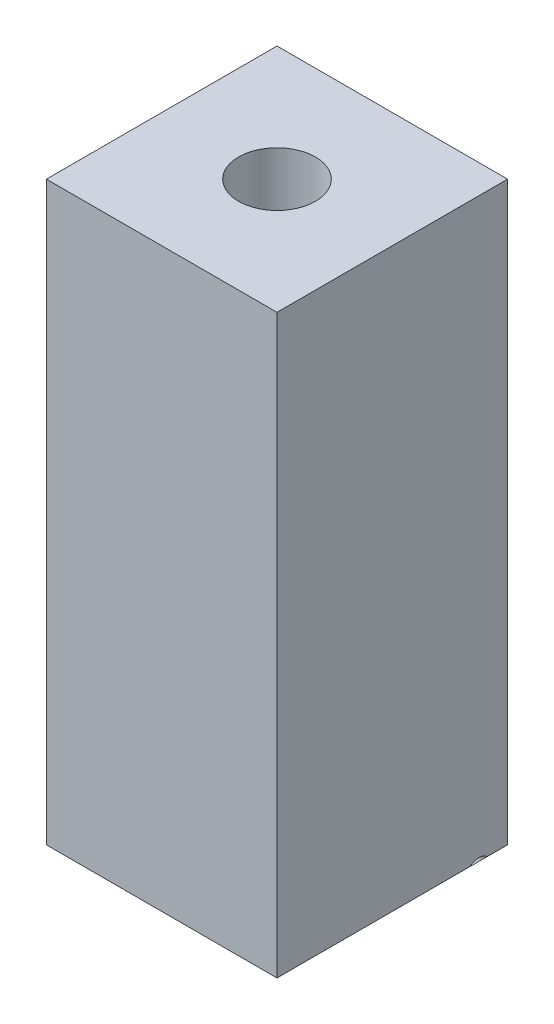
ISO-10303-21;
HEADER;
FILE_DESCRIPTION(('STEP AP214'),'2;1');
FILE_NAME('part.step','',(''),(''),'','','');
FILE_SCHEMA(('AUTOMOTIVE_DESIGN { 1 0 10303 214 1 1 1 1 }'));
ENDSEC;
DATA;
#1=APPLICATION_CONTEXT('core data for automotive mechanical design processes');
#2=APPLICATION_PROTOCOL_DEFINITION('international standard','automotive_design',2000,#1);
#3=PRODUCT_CONTEXT('',#1,'mechanical');
#4=PRODUCT('Part','Part','',(#3));
#5=PRODUCT_RELATED_PRODUCT_CATEGORY('part','',(#4));
#6=PRODUCT_DEFINITION_FORMATION('','',#4);
#7=PRODUCT_DEFINITION_CONTEXT('part definition',#1,'design');
#8=PRODUCT_DEFINITION('design','',#6,#7);
#9=PRODUCT_DEFINITION_SHAPE('','',#8);
#10=(LENGTH_UNIT() NAMED_UNIT(*) SI_UNIT(.MILLI.,.METRE.));
#11=(NAMED_UNIT(*) PLANE_ANGLE_UNIT() SI_UNIT($,.RADIAN.));
#12=(NAMED_UNIT(*) SI_UNIT($,.STERADIAN.) SOLID_ANGLE_UNIT());
#13=UNCERTAINTY_MEASURE_WITH_UNIT(LENGTH_MEASURE(1.E-05),#10,'distance_accuracy_value','');
#14=(GEOMETRIC_REPRESENTATION_CONTEXT(3) GLOBAL_UNCERTAINTY_ASSIGNED_CONTEXT((#13)) GLOBAL_UNIT_ASSIGNED_CONTEXT((#10,
#11,#12)) REPRESENTATION_CONTEXT('',''));
#15=CARTESIAN_POINT('',(0.,0.,0.));
#16=DIRECTION('',(0.,0.,1.));
#17=DIRECTION('',(1.,0.,0.));
#18=AXIS2_PLACEMENT_3D('',#15,#16,#17);
#19=CARTESIAN_POINT('',(30.,0.,66.4536174180387));
#20=DIRECTION('',(0.,-1.,0.));
#21=DIRECTION('',(0.,0.,-1.));
#22=AXIS2_PLACEMENT_3D('',#19,#20,#21);
#23=PLANE('',#22);
#24=CARTESIAN_POINT('',(0.,0.,96.4536174180387));
#25=DIRECTION('',(0.,-1.,0.));
#26=DIRECTION('',(0.,0.,-1.));
#27=AXIS2_PLACEMENT_3D('',#24,#25,#26);
#28=CIRCLE('',#27,23.5);
#29=CARTESIAN_POINT('',(19.9999999999999,0.,108.792580097292));
#30=VERTEX_POINT('',#29);
#31=CARTESIAN_POINT('',(12.3389626792527,0.,116.453617418039));
#32=VERTEX_POINT('',#31);
#33=EDGE_CURVE('E298',#30,#32,#28,.T.);
#34=ORIENTED_EDGE('',*,*,#33,.F.);
#35=DIRECTION('',(0.,0.,1.));
#36=VECTOR('',#35,1.);
#37=CARTESIAN_POINT('',(19.9999999999999,0.,126.453617418039));
#38=LINE('',#37,#36);
#39=CARTESIAN_POINT('',(19.9999999999999,0.,116.453617418039));
#40=VERTEX_POINT('',#39);
#41=EDGE_CURVE('E258',#30,#40,#38,.T.);
#42=ORIENTED_EDGE('',*,*,#41,.T.);
#43=DIRECTION('',(-1.,0.,0.));
#44=VECTOR('',#43,1.);
#45=CARTESIAN_POINT('',(30.,0.,116.453617418039));
#46=LINE('',#45,#44);
#47=EDGE_CURVE('E256',#40,#32,#46,.T.);
#48=ORIENTED_EDGE('',*,*,#47,.T.);
#49=EDGE_LOOP('',(#34,#42,#48));
#50=FACE_BOUND('',#49,.T.);
#51=ADVANCED_FACE('F45',(#50),#23,.T.);
#52=CARTESIAN_POINT('',(-12.3389626792527,0.,116.453617418039));
#53=VERTEX_POINT('',#52);
#54=CARTESIAN_POINT('',(-19.9999999999999,0.,108.792580097292));
#55=VERTEX_POINT('',#54);
#56=EDGE_CURVE('E238',#53,#55,#28,.T.);
#57=ORIENTED_EDGE('',*,*,#56,.F.);
#58=DIRECTION('',(-1.,0.,0.));
#59=VECTOR('',#58,1.);
#60=CARTESIAN_POINT('',(30.,0.,116.453617418039));
#61=LINE('',#60,#59);
#62=CARTESIAN_POINT('',(-19.9999999999999,0.,116.453617418039));
#63=VERTEX_POINT('',#62);
#64=EDGE_CURVE('E250',#53,#63,#61,.T.);
#65=ORIENTED_EDGE('',*,*,#64,.T.);
#66=DIRECTION('',(0.,0.,-1.));
#67=VECTOR('',#66,1.);
#68=CARTESIAN_POINT('',(-19.9999999999999,0.,66.4536174180387));
#69=LINE('',#68,#67);
#70=EDGE_CURVE('E248',#63,#55,#69,.T.);
#71=ORIENTED_EDGE('',*,*,#70,.T.);
#72=EDGE_LOOP('',(#57,#65,#71));
#73=FACE_BOUND('',#72,.T.);
#74=ADVANCED_FACE('F204',(#73),#23,.T.);
#75=CARTESIAN_POINT('',(-19.9999999999999,0.,84.1146547387855));
#76=VERTEX_POINT('',#75);
#77=CARTESIAN_POINT('',(-12.3389626792532,0.,76.4536174180388));
#78=VERTEX_POINT('',#77);
#79=EDGE_CURVE('E231',#76,#78,#28,.T.);
#80=ORIENTED_EDGE('',*,*,#79,.F.);
#81=DIRECTION('',(0.,0.,-1.));
#82=VECTOR('',#81,1.);
#83=CARTESIAN_POINT('',(-19.9999999999999,0.,66.4536174180387));
#84=LINE('',#83,#82);
#85=CARTESIAN_POINT('',(-19.9999999999999,0.,76.4536174180388));
#86=VERTEX_POINT('',#85);
#87=EDGE_CURVE('E233',#76,#86,#84,.T.);
#88=ORIENTED_EDGE('',*,*,#87,.T.);
#89=DIRECTION('',(1.,0.,0.));
#90=VECTOR('',#89,1.);
#91=CARTESIAN_POINT('',(30.,0.,76.4536174180388));
#92=LINE('',#91,#90);
#93=EDGE_CURVE('E236',#86,#78,#92,.T.);
#94=ORIENTED_EDGE('',*,*,#93,.T.);
#95=EDGE_LOOP('',(#80,#88,#94));
#96=FACE_BOUND('',#95,.T.);
#97=ADVANCED_FACE('F211',(#96),#23,.T.);
#98=CARTESIAN_POINT('',(30.,160.,66.4536174180387));
#99=DIRECTION('',(0.,0.,-1.));
#100=DIRECTION('',(-1.,0.,0.));
#101=AXIS2_PLACEMENT_3D('',#98,#99,#100);
#102=PLANE('',#101);
#103=DIRECTION('',(0.,-1.,0.));
#104=VECTOR('',#103,1.);
#105=CARTESIAN_POINT('',(30.,160.,66.4536174180387));
#106=LINE('',#105,#104);
#107=CARTESIAN_POINT('',(30.,160.,66.4536174180387));
#108=VERTEX_POINT('',#107);
#109=CARTESIAN_POINT('',(30.,10.0000000000002,66.4536174180387));
#110=VERTEX_POINT('',#109);
#111=EDGE_CURVE('E150',#108,#110,#106,.T.);
#112=ORIENTED_EDGE('',*,*,#111,.T.);
#113=DIRECTION('',(-1.,0.,0.));
#114=VECTOR('',#113,1.);
#115=CARTESIAN_POINT('',(30.,10.0000000000002,66.4536174180387));
#116=LINE('',#115,#114);
#117=CARTESIAN_POINT('',(-30.,10.0000000000002,66.4536174180387));
#118=VERTEX_POINT('',#117);
#119=EDGE_CURVE('E11',#110,#118,#116,.T.);
#120=ORIENTED_EDGE('',*,*,#119,.T.);
#121=DIRECTION('',(0.,-1.,0.));
#122=VECTOR('',#121,1.);
#123=CARTESIAN_POINT('',(-30.,160.,66.4536174180387));
#124=LINE('',#123,#122);
#125=CARTESIAN_POINT('',(-30.,160.,66.4536174180387));
#126=VERTEX_POINT('',#125);
#127=EDGE_CURVE('E164',#126,#118,#124,.T.);
#128=ORIENTED_EDGE('',*,*,#127,.F.);
#129=DIRECTION('',(-1.,0.,0.));
#130=VECTOR('',#129,1.);
#131=CARTESIAN_POINT('',(30.,160.,66.4536174180387));
#132=LINE('',#131,#130);
#133=EDGE_CURVE('E157',#108,#126,#132,.T.);
#134=ORIENTED_EDGE('',*,*,#133,.F.);
#135=EDGE_LOOP('',(#112,#120,#128,#134));
#136=FACE_BOUND('',#135,.T.);
#137=ADVANCED_FACE('F224',(#136),#102,.T.);
#138=CARTESIAN_POINT('',(30.,160.,126.453617418039));
#139=DIRECTION('',(0.,1.,0.));
#140=DIRECTION('',(0.,0.,1.));
#141=AXIS2_PLACEMENT_3D('',#138,#139,#140);
#142=PLANE('',#141);
#143=CARTESIAN_POINT('',(0.,160.,96.4536174180387));
#144=DIRECTION('',(0.,-1.,0.));
#145=DIRECTION('',(0.,0.,-1.));
#146=AXIS2_PLACEMENT_3D('',#143,#144,#145);
#147=CIRCLE('',#146,9.99999999999999);
#148=CARTESIAN_POINT('',(0.,160.,86.4536174180387));
#149=VERTEX_POINT('',#148);
#150=EDGE_CURVE('E181',#149,#149,#147,.T.);
#151=ORIENTED_EDGE('',*,*,#150,.T.);
#152=EDGE_LOOP('',(#151));
#153=FACE_BOUND('',#152,.T.);
#154=DIRECTION('',(0.,0.,-1.));
#155=VECTOR('',#154,1.);
#156=CARTESIAN_POINT('',(-30.,160.,126.453617418039));
#157=LINE('',#156,#155);
#158=CARTESIAN_POINT('',(-30.,160.,126.453617418039));
#159=VERTEX_POINT('',#158);
#160=EDGE_CURVE('E156',#159,#126,#157,.T.);
#161=ORIENTED_EDGE('',*,*,#160,.F.);
#162=DIRECTION('',(-1.,0.,0.));
#163=VECTOR('',#162,1.);
#164=CARTESIAN_POINT('',(30.,160.,126.453617418039));
#165=LINE('',#164,#163);
#166=CARTESIAN_POINT('',(30.,160.,126.453617418039));
#167=VERTEX_POINT('',#166);
#168=EDGE_CURVE('E141',#167,#159,#165,.T.);
#169=ORIENTED_EDGE('',*,*,#168,.F.);
#170=DIRECTION('',(0.,0.,-1.));
#171=VECTOR('',#170,1.);
#172=CARTESIAN_POINT('',(30.,160.,126.453617418039));
#173=LINE('',#172,#171);
#174=EDGE_CURVE('E149',#167,#108,#173,.T.);
#175=ORIENTED_EDGE('',*,*,#174,.T.);
#176=ORIENTED_EDGE('',*,*,#133,.T.);
#177=EDGE_LOOP('',(#161,#169,#175,#176));
#178=FACE_BOUND('',#177,.T.);
#179=ADVANCED_FACE('F154',(#153,#178),#142,.T.);
#180=CARTESIAN_POINT('',(30.,0.,126.453617418039));
#181=DIRECTION('',(0.,0.,1.));
#182=DIRECTION('',(1.,0.,0.));
#183=AXIS2_PLACEMENT_3D('',#180,#181,#182);
#184=PLANE('',#183);
#185=DIRECTION('',(0.,1.,0.));
#186=VECTOR('',#185,1.);
#187=CARTESIAN_POINT('',(-30.,0.,126.453617418039));
#188=LINE('',#187,#186);
#189=CARTESIAN_POINT('',(-30.,10.0000000000002,126.453617418039));
#190=VERTEX_POINT('',#189);
#191=EDGE_CURVE('E166',#190,#159,#188,.T.);
#192=ORIENTED_EDGE('',*,*,#191,.F.);
#193=DIRECTION('',(1.,0.,0.));
#194=VECTOR('',#193,1.);
#195=CARTESIAN_POINT('',(30.,10.0000000000002,126.453617418039));
#196=LINE('',#195,#194);
#197=CARTESIAN_POINT('',(30.,10.0000000000002,126.453617418039));
#198=VERTEX_POINT('',#197);
#199=EDGE_CURVE('E144',#190,#198,#196,.T.);
#200=ORIENTED_EDGE('',*,*,#199,.T.);
#201=DIRECTION('',(0.,1.,0.));
#202=VECTOR('',#201,1.);
#203=CARTESIAN_POINT('',(30.,0.,126.453617418039));
#204=LINE('',#203,#202);
#205=EDGE_CURVE('E138',#198,#167,#204,.T.);
#206=ORIENTED_EDGE('',*,*,#205,.T.);
#207=ORIENTED_EDGE('',*,*,#168,.T.);
#208=EDGE_LOOP('',(#192,#200,#206,#207));
#209=FACE_BOUND('',#208,.T.);
#210=ADVANCED_FACE('F140',(#209),#184,.T.);
#211=DIRECTION('',(1.,0.,0.));
#212=VECTOR('',#211,1.);
#213=CARTESIAN_POINT('',(30.,0.,76.4536174180388));
#214=LINE('',#213,#212);
#215=CARTESIAN_POINT('',(12.3389626792532,0.,76.4536174180388));
#216=VERTEX_POINT('',#215);
#217=CARTESIAN_POINT('',(19.9999999999999,0.,76.4536174180388));
#218=VERTEX_POINT('',#217);
#219=EDGE_CURVE('E170',#216,#218,#214,.T.);
#220=ORIENTED_EDGE('',*,*,#219,.T.);
#221=DIRECTION('',(0.,0.,1.));
#222=VECTOR('',#221,1.);
#223=CARTESIAN_POINT('',(19.9999999999999,0.,126.453617418039));
#224=LINE('',#223,#222);
#225=CARTESIAN_POINT('',(19.9999999999999,0.,84.1146547387855));
#226=VERTEX_POINT('',#225);
#227=EDGE_CURVE('E252',#218,#226,#224,.T.);
#228=ORIENTED_EDGE('',*,*,#227,.T.);
#229=EDGE_CURVE('E240',#216,#226,#28,.T.);
#230=ORIENTED_EDGE('',*,*,#229,.F.);
#231=EDGE_LOOP('',(#220,#228,#230));
#232=FACE_BOUND('',#231,.T.);
#233=ADVANCED_FACE('F207',(#232),#23,.T.);
#234=CARTESIAN_POINT('',(30.,0.,0.));
#235=DIRECTION('',(-1.,0.,0.));
#236=DIRECTION('',(0.,0.,1.));
#237=AXIS2_PLACEMENT_3D('',#234,#235,#236);
#238=PLANE('',#237);
#239=ORIENTED_EDGE('',*,*,#205,.F.);
#240=DIRECTION('',(0.,0.,-1.));
#241=VECTOR('',#240,1.);
#242=CARTESIAN_POINT('',(30.,10.0000000000002,66.4536174180387));
#243=LINE('',#242,#241);
#244=CARTESIAN_POINT('',(30.,10.0000000000002,76.1835277301363));
#245=VERTEX_POINT('',#244);
#246=EDGE_CURVE('E269',#198,#245,#243,.T.);
#247=ORIENTED_EDGE('',*,*,#246,.T.);
#248=CARTESIAN_POINT('',(30.,7.5,73.9536174180387));
#249=DIRECTION('',(-1.,0.,0.));
#250=DIRECTION('',(0.,0.,1.));
#251=AXIS2_PLACEMENT_3D('',#248,#249,#250);
#252=CIRCLE('',#251,3.34999999999999);
#253=CARTESIAN_POINT('',(30.,10.0000000000002,71.7237071059411));
#254=VERTEX_POINT('',#253);
#255=EDGE_CURVE('E167',#245,#254,#252,.T.);
#256=ORIENTED_EDGE('',*,*,#255,.T.);
#257=DIRECTION('',(0.,0.,-1.));
#258=VECTOR('',#257,1.);
#259=CARTESIAN_POINT('',(30.,10.0000000000002,66.4536174180387));
#260=LINE('',#259,#258);
#261=EDGE_CURVE('E267',#254,#110,#260,.T.);
#262=ORIENTED_EDGE('',*,*,#261,.T.);
#263=ORIENTED_EDGE('',*,*,#111,.F.);
#264=ORIENTED_EDGE('',*,*,#174,.F.);
#265=EDGE_LOOP('',(#239,#247,#256,#262,#263,#264));
#266=FACE_BOUND('',#265,.T.);
#267=ADVANCED_FACE('F160',(#266),#238,.F.);
#268=CARTESIAN_POINT('',(-30.,0.,0.));
#269=DIRECTION('',(-1.,0.,0.));
#270=DIRECTION('',(0.,0.,1.));
#271=AXIS2_PLACEMENT_3D('',#268,#269,#270);
#272=PLANE('',#271);
#273=ORIENTED_EDGE('',*,*,#127,.T.);
#274=DIRECTION('',(0.,0.,1.));
#275=VECTOR('',#274,1.);
#276=CARTESIAN_POINT('',(-30.,10.0000000000002,0.));
#277=LINE('',#276,#275);
#278=CARTESIAN_POINT('',(-30.,10.0000000000002,71.7237071059411));
#279=VERTEX_POINT('',#278);
#280=EDGE_CURVE('E55',#118,#279,#277,.T.);
#281=ORIENTED_EDGE('',*,*,#280,.T.);
#282=CARTESIAN_POINT('',(-30.,7.5,73.9536174180387));
#283=DIRECTION('',(-1.,0.,0.));
#284=DIRECTION('',(0.,0.,1.));
#285=AXIS2_PLACEMENT_3D('',#282,#283,#284);
#286=CIRCLE('',#285,3.34999999999999);
#287=CARTESIAN_POINT('',(-30.,10.0000000000002,76.1835277301363));
#288=VERTEX_POINT('',#287);
#289=EDGE_CURVE('E180',#288,#279,#286,.T.);
#290=ORIENTED_EDGE('',*,*,#289,.F.);
#291=DIRECTION('',(0.,0.,1.));
#292=VECTOR('',#291,1.);
#293=CARTESIAN_POINT('',(-30.,10.0000000000002,0.));
#294=LINE('',#293,#292);
#295=EDGE_CURVE('E69',#288,#190,#294,.T.);
#296=ORIENTED_EDGE('',*,*,#295,.T.);
#297=ORIENTED_EDGE('',*,*,#191,.T.);
#298=ORIENTED_EDGE('',*,*,#160,.T.);
#299=EDGE_LOOP('',(#273,#281,#290,#296,#297,#298));
#300=FACE_BOUND('',#299,.T.);
#301=ADVANCED_FACE('F222',(#300),#272,.T.);
#302=CARTESIAN_POINT('',(-30.,7.5,73.9536174180387));
#303=DIRECTION('',(-1.,0.,0.));
#304=DIRECTION('',(0.,0.,1.));
#305=AXIS2_PLACEMENT_3D('',#302,#303,#304);
#306=CYLINDRICAL_SURFACE('',#305,3.34999999999999);
#307=CARTESIAN_POINT('',(13.6208479912229,7.5,77.3036174180387));
#308=CARTESIAN_POINT('',(13.6208466619542,7.6311400342407,77.3036163206529));
#309=CARTESIAN_POINT('',(13.6099252487751,7.76228647985704,77.2958343639586));
#310=CARTESIAN_POINT('',(13.5673236686955,8.01941730547468,77.2656426726311));
#311=CARTESIAN_POINT('',(13.5356257146644,8.14539716399272,77.2432204042549));
#312=CARTESIAN_POINT('',(13.4545806660588,8.38718801192244,77.1863746845912));
#313=CARTESIAN_POINT('',(13.4053920316084,8.503079033955,77.152059051906));
#314=CARTESIAN_POINT('',(13.2925504315977,8.72408430713149,77.0741743978733));
#315=CARTESIAN_POINT('',(13.2288904079872,8.82919326317427,77.0306008619002));
#316=CARTESIAN_POINT('',(13.0564704708785,9.07635564573666,76.9140704555163));
#317=CARTESIAN_POINT('',(12.9407965778896,9.21166142181079,76.8371006716536));
#318=CARTESIAN_POINT('',(12.6917538316594,9.45915276178947,76.6750537610005));
#319=CARTESIAN_POINT('',(12.5583411355996,9.57127922285575,76.589956698768));
#320=CARTESIAN_POINT('',(12.3030731437344,9.75767369357391,76.4310544039084));
#321=CARTESIAN_POINT('',(12.1831508574361,9.83513668448344,76.3578108816436));
#322=CARTESIAN_POINT('',(11.9366888516174,9.97785567557276,76.210443644832));
#323=CARTESIAN_POINT('',(11.8101446468933,10.043103261335,76.1363193606902));
#324=CARTESIAN_POINT('',(11.5518047928005,10.1629911391905,75.9883295047865));
#325=CARTESIAN_POINT('',(11.4200029515304,10.217618451013,75.9144643566249));
#326=CARTESIAN_POINT('',(11.1522743482304,10.3175972118923,75.7678714800301));
#327=CARTESIAN_POINT('',(11.0163460156705,10.3629450770784,75.6951442010375));
#328=CARTESIAN_POINT('',(10.7449327231521,10.4444362373895,75.5533968790422));
#329=CARTESIAN_POINT('',(10.6095369160104,10.4807969725784,75.4843298295574));
#330=CARTESIAN_POINT('',(10.3361171064447,10.5468529932768,75.3482145432371));
#331=CARTESIAN_POINT('',(10.1980925903566,10.576546961261,75.2811667077133));
#332=CARTESIAN_POINT('',(9.78052834004733,10.6569624948289,75.0834031992393));
#333=CARTESIAN_POINT('',(9.49765148805558,10.6989739102928,74.9561479182778));
#334=CARTESIAN_POINT('',(8.92462141111508,10.7654854585037,74.7119858305651));
#335=CARTESIAN_POINT('',(8.63444934773781,10.7899340895518,74.5951103329764));
#336=CARTESIAN_POINT('',(8.04906953906571,10.8255681565136,74.3728459750843));
#337=CARTESIAN_POINT('',(7.75386315757159,10.8367571283518,74.2674540592895));
#338=CARTESIAN_POINT('',(7.15845739235453,10.8495293638289,74.0682349567256));
#339=CARTESIAN_POINT('',(6.85824603348084,10.8510847412403,73.9744421129041));
#340=CARTESIAN_POINT('',(6.25430144800571,10.8475788578265,73.798979472454));
#341=CARTESIAN_POINT('',(5.95056760964195,10.8425164300752,73.7173118167034));
#342=CARTESIAN_POINT('',(5.3399263700233,10.8283876163707,73.5661929464841));
#343=CARTESIAN_POINT('',(5.03301666961357,10.8193180977243,73.4967513497136));
#344=CARTESIAN_POINT('',(4.41673180409244,10.7994380846286,73.3702591843048));
#345=CARTESIAN_POINT('',(4.10735677595087,10.7886276862678,73.3132079321857));
#346=CARTESIAN_POINT('',(3.48682101610009,10.7672038781526,73.2116114457197));
#347=CARTESIAN_POINT('',(3.17566200952861,10.7565903100244,73.1670557097059));
#348=CARTESIAN_POINT('',(2.55174824457283,10.7371304977182,73.0904548851586));
#349=CARTESIAN_POINT('',(2.2389934766106,10.7282842641606,73.0584098718053));
#350=CARTESIAN_POINT('',(1.61253573719338,10.7135571453532,73.0069022588271));
#351=CARTESIAN_POINT('',(1.29883332435654,10.7076747648231,72.9874333131054));
#352=CARTESIAN_POINT('',(0.67085183549784,10.6996225980416,72.9610926355776));
#353=CARTESIAN_POINT('',(0.356572760963537,10.6974528022266,72.9542208713212));
#354=CARTESIAN_POINT('',(-0.281697180513214,10.6970944633411,72.9530726103616));
#355=CARTESIAN_POINT('',(-0.605688907060917,10.6990306548857,72.9591907365452));
#356=CARTESIAN_POINT('',(-1.25309574805771,10.7068830318171,72.984814657702));
#357=CARTESIAN_POINT('',(-1.57651085440956,10.7127992726597,73.0043206392138));
#358=CARTESIAN_POINT('',(-2.22236909723226,10.727811296452,73.0566922451329));
#359=CARTESIAN_POINT('',(-2.54481156093516,10.7369089220842,73.0895656138342));
#360=CARTESIAN_POINT('',(-3.18799774946161,10.7569803312508,73.1686081661983));
#361=CARTESIAN_POINT('',(-3.50874149019099,10.7679540971859,73.2147772251433));
#362=CARTESIAN_POINT('',(-4.1483853844165,10.7900515265688,73.3203926563656));
#363=CARTESIAN_POINT('',(-4.46728317917427,10.801175338785,73.3798532807612));
#364=CARTESIAN_POINT('',(-5.10242992476574,10.8214287121385,73.5119429383866));
#365=CARTESIAN_POINT('',(-5.41867870625504,10.8305581467021,73.5845728068704));
#366=CARTESIAN_POINT('',(-6.04771897938167,10.8443041532492,73.7428230189215));
#367=CARTESIAN_POINT('',(-6.36051331343829,10.8489247592151,73.8284316711729));
#368=CARTESIAN_POINT('',(-6.98227484532985,10.8507473488702,74.0125186035795));
#369=CARTESIAN_POINT('',(-7.29124279125689,10.8479508064367,74.1109943231954));
#370=CARTESIAN_POINT('',(-7.90290319977337,10.8315476308124,74.31997795871));
#371=CARTESIAN_POINT('',(-8.20562099550891,10.8180011605844,74.4304159647692));
#372=CARTESIAN_POINT('',(-8.80558591646304,10.7760955177181,74.6633638678835));
#373=CARTESIAN_POINT('',(-9.10283096014738,10.7477308247958,74.7858782499837));
#374=CARTESIAN_POINT('',(-9.54272947592241,10.6903011348019,74.9777736336153));
#375=CARTESIAN_POINT('',(-9.68818853713243,10.6687138699878,75.0430057371562));
#376=CARTESIAN_POINT('',(-9.97694863704766,10.6198136706012,75.1760295593985));
#377=CARTESIAN_POINT('',(-10.1202499876347,10.592501572196,75.2438209031138));
#378=CARTESIAN_POINT('',(-10.4041681903381,10.5313238267869,75.3816417549036));
#379=CARTESIAN_POINT('',(-10.5447878116739,10.4974653928944,75.4516687293789));
#380=CARTESIAN_POINT('',(-10.8230250164752,10.422177435641,75.5936911494058));
#381=CARTESIAN_POINT('',(-10.960642115825,10.3807467013016,75.6656869082414));
#382=CARTESIAN_POINT('',(-11.2331375660562,10.2888516907852,75.8116535941674));
#383=CARTESIAN_POINT('',(-11.3679899354366,10.2383260885365,75.885634833518));
#384=CARTESIAN_POINT('',(-11.6329686777152,10.1271150739358,76.0343348718762));
#385=CARTESIAN_POINT('',(-11.7630973188533,10.0664346184223,76.1090532943818));
#386=CARTESIAN_POINT('',(-12.0169616286069,9.93359458258147,76.2579694431191));
#387=CARTESIAN_POINT('',(-12.1407192453926,9.86147847194227,76.3321680725683));
#388=CARTESIAN_POINT('',(-12.3804911999844,9.70397387094612,76.4788046140213));
#389=CARTESIAN_POINT('',(-12.4965133281862,9.61859903108465,76.5512442492739));
#390=CARTESIAN_POINT('',(-12.7144331951518,9.43611439173926,76.6897807985561));
#391=CARTESIAN_POINT('',(-12.8166915723423,9.33954560777955,76.7560126522429));
#392=CARTESIAN_POINT('',(-13.008804828091,9.13091377438309,76.8823574731387));
#393=CARTESIAN_POINT('',(-13.0986513135233,9.01884034195663,76.9424662927074));
#394=CARTESIAN_POINT('',(-13.2627515786395,8.77682158308991,77.0536333828731));
#395=CARTESIAN_POINT('',(-13.3367865327529,8.6466620817563,77.1045632836331));
#396=CARTESIAN_POINT('',(-13.4306988055424,8.44034182761299,77.169743323447));
#397=CARTESIAN_POINT('',(-13.4591337218672,8.36976933916158,77.189591920933));
#398=CARTESIAN_POINT('',(-13.5096539613935,8.22536745272187,77.2249878896889));
#399=CARTESIAN_POINT('',(-13.5317423569637,8.15153965067453,77.2405373420491));
#400=CARTESIAN_POINT('',(-13.5766614778861,7.96998774555736,77.2722376297087));
#401=CARTESIAN_POINT('',(-13.5959866871133,7.86092632741211,77.2859534529749));
#402=CARTESIAN_POINT('',(-13.6192827849321,7.6404073010911,77.3024986820916));
#403=CARTESIAN_POINT('',(-13.6232615543604,7.52895095235998,77.3053336755564));
#404=CARTESIAN_POINT('',(-13.6156047022449,7.30684167118386,77.299888614783));
#405=CARTESIAN_POINT('',(-13.603967114992,7.19618884164469,77.291607161262));
#406=CARTESIAN_POINT('',(-13.5658975351209,6.97878409248555,77.2646374022981));
#407=CARTESIAN_POINT('',(-13.5394594218255,6.87203380621042,77.2459447913941));
#408=CARTESIAN_POINT('',(-13.4727948527124,6.66279889608957,77.1991252749759));
#409=CARTESIAN_POINT('',(-13.432310581553,6.5604373817063,77.1708221938619));
#410=CARTESIAN_POINT('',(-13.3397984423592,6.3636644562006,77.1067067357729));
#411=CARTESIAN_POINT('',(-13.2877656528069,6.26925645828446,77.0708911576299));
#412=CARTESIAN_POINT('',(-13.1399792301579,6.03461448774008,76.9702154006445));
#413=CARTESIAN_POINT('',(-13.0367637257414,5.90101136314246,76.900850962656));
#414=CARTESIAN_POINT('',(-12.8128458997817,5.65487136298002,76.753388031592));
#415=CARTESIAN_POINT('',(-12.6920952799297,5.54239470671344,76.6752655556948));
#416=CARTESIAN_POINT('',(-12.4625749700502,5.35625036973948,76.5300377804102));
#417=CARTESIAN_POINT('',(-12.3559490540118,5.27927678709045,76.4636930950197));
#418=CARTESIAN_POINT('',(-12.1363182041893,5.13634775379473,76.329593486694));
#419=CARTESIAN_POINT('',(-12.0233091659278,5.07039950309504,76.2618376744635));
#420=CARTESIAN_POINT('',(-11.7921921633021,4.94821144083874,76.1259956791955));
#421=CARTESIAN_POINT('',(-11.6740784283574,4.89198299590155,76.0579092038177));
#422=CARTESIAN_POINT('',(-11.4338092703422,4.78812154254766,75.9222499229955));
#423=CARTESIAN_POINT('',(-11.3116523151354,4.74049183770139,75.8546773244883));
#424=CARTESIAN_POINT('',(-11.0702608554472,4.6549959728939,75.7239958145562));
#425=CARTESIAN_POINT('',(-10.9511851850597,4.61676094467574,75.6608325428108));
#426=CARTESIAN_POINT('',(-10.710549919177,4.54633408572129,75.5358612720658));
#427=CARTESIAN_POINT('',(-10.5889898577801,4.51414340023738,75.4740535318612));
#428=CARTESIAN_POINT('',(-10.2210135125269,4.4255382373361,75.2910118162823));
#429=CARTESIAN_POINT('',(-9.97142905855047,4.37713410333472,75.1722288097904));
#430=CARTESIAN_POINT('',(-9.46547067803055,4.29693502212858,74.9424023466556));
#431=CARTESIAN_POINT('',(-9.20908111204026,4.26518258799125,74.8313793214667));
#432=CARTESIAN_POINT('',(-8.69150810860246,4.21475514832709,74.6181875426619));
#433=CARTESIAN_POINT('',(-8.43032602656406,4.19607650206227,74.5160163309772));
#434=CARTESIAN_POINT('',(-7.8928095985863,4.16816146847307,74.316788407927));
#435=CARTESIAN_POINT('',(-7.61630425282375,4.1593619996128,74.2201359690527));
#436=CARTESIAN_POINT('',(-7.05971454250561,4.14979073987696,74.0371887626715));
#437=CARTESIAN_POINT('',(-6.77962946534809,4.14902057308858,73.9508960941248));
#438=CARTESIAN_POINT('',(-6.21623073895042,4.15307476704106,73.788788247959));
#439=CARTESIAN_POINT('',(-5.93291446103037,4.15790406063478,73.71298237459));
#440=CARTESIAN_POINT('',(-5.36374527634521,4.1710493616329,73.5720486701546));
#441=CARTESIAN_POINT('',(-5.07789252752665,4.17936515340319,73.5069201790564));
#442=CARTESIAN_POINT('',(-4.50390376715202,4.19764572708485,73.3873906035935));
#443=CARTESIAN_POINT('',(-4.21576699007555,4.20761108622483,73.3329932890162));
#444=CARTESIAN_POINT('',(-3.63765953154818,4.22759807462678,73.23501742894));
#445=CARTESIAN_POINT('',(-3.34768883484065,4.23761970435678,73.1914389735663));
#446=CARTESIAN_POINT('',(-2.76641249275484,4.25638181082449,73.1151760707465));
#447=CARTESIAN_POINT('',(-2.47510753195079,4.26512288202231,73.0824865594067));
#448=CARTESIAN_POINT('',(-1.89141651572975,4.28028345227538,73.0280233085596));
#449=CARTESIAN_POINT('',(-1.59903045601984,4.28670294210187,73.0062496124448));
#450=CARTESIAN_POINT('',(-0.990688676055729,4.29687367639018,72.9723811512908));
#451=CARTESIAN_POINT('',(-0.67467865040165,4.30037686966907,72.9611769205752));
#452=CARTESIAN_POINT('',(-0.0424409839171763,4.30338558225804,72.9515290910727));
#453=CARTESIAN_POINT('',(0.273786659947555,4.30289104464863,72.9530856739736));
#454=CARTESIAN_POINT('',(0.906002580608579,4.29796683300036,72.968958970292));
#455=CARTESIAN_POINT('',(1.22199073206859,4.29353575774144,72.983280227332));
#456=CARTESIAN_POINT('',(1.85306084643124,4.28130502551392,73.0246576226546));
#457=CARTESIAN_POINT('',(2.16814281750396,4.2735053990125,73.0517136457566));
#458=CARTESIAN_POINT('',(2.79641859520187,4.25558976048991,73.1184574165211));
#459=CARTESIAN_POINT('',(3.10961452368499,4.24547723698927,73.1581261753184));
#460=CARTESIAN_POINT('',(3.7341388882668,4.22437694995397,73.2500437321319));
#461=CARTESIAN_POINT('',(4.04546723743148,4.21338914601062,73.3022931111775));
#462=CARTESIAN_POINT('',(4.66563694919152,4.19235786215786,73.4192657649889));
#463=CARTESIAN_POINT('',(4.97447951633816,4.18231389611054,73.4839825652461));
#464=CARTESIAN_POINT('',(5.5893572675505,4.16531117461443,73.6258139974055));
#465=CARTESIAN_POINT('',(5.89539285185019,4.15835197241043,73.7029268318291));
#466=CARTESIAN_POINT('',(6.43740739324477,4.15093550682353,73.8511733074808));
#467=CARTESIAN_POINT('',(6.67402881835702,4.14938689578085,73.9199083633397));
#468=CARTESIAN_POINT('',(7.14496337311235,4.15106077427458,74.0647769590003));
#469=CARTESIAN_POINT('',(7.37927675012189,4.15428274679478,74.1409096962363));
#470=CARTESIAN_POINT('',(7.84558641986219,4.16705089026733,74.3005681849941));
#471=CARTESIAN_POINT('',(8.0775789124627,4.17660611419723,74.3841043709789));
#472=CARTESIAN_POINT('',(8.53841557681435,4.20384097330543,74.5582725996051));
#473=CARTESIAN_POINT('',(8.76725985590868,4.22152033076823,74.6489043996022));
#474=CARTESIAN_POINT('',(9.2233278970855,4.26732446668803,74.8378426728202));
#475=CARTESIAN_POINT('',(9.45051504207426,4.29554784117127,74.9362144405112));
#476=CARTESIAN_POINT('',(9.90015062241129,4.36502520888688,75.1393529247746));
#477=CARTESIAN_POINT('',(10.122597245288,4.40628409392636,75.2441220301352));
#478=CARTESIAN_POINT('',(10.5604011853023,4.50481072257912,75.4586867714365));
#479=CARTESIAN_POINT('',(10.7757827018302,4.56201560373334,75.5684612817941));
#480=CARTESIAN_POINT('',(11.1980755216404,4.69633939848507,75.7918175269341));
#481=CARTESIAN_POINT('',(11.4049962224565,4.77343548197773,75.9053947679339));
#482=CARTESIAN_POINT('',(11.7559682835387,4.92961904573576,76.1047356953615));
#483=CARTESIAN_POINT('',(11.9026114148456,5.00320019225342,76.190217145706));
#484=CARTESIAN_POINT('',(12.1874619834234,5.16664916625618,76.3602541481214));
#485=CARTESIAN_POINT('',(12.325662847758,5.25652947313349,76.4448089377275));
#486=CARTESIAN_POINT('',(12.5914520115073,5.45600663177004,76.6109844131459));
#487=CARTESIAN_POINT('',(12.71894419596,5.56575883130034,76.6925754211656));
#488=CARTESIAN_POINT('',(12.9571073992163,5.80706534453204,76.8479174251752));
#489=CARTESIAN_POINT('',(13.0678090635129,5.93857899938929,76.9216826287345));
#490=CARTESIAN_POINT('',(13.2357818474895,6.18169227506079,77.0352978526594));
#491=CARTESIAN_POINT('',(13.29911661128,6.2874191287971,77.0786816733823));
#492=CARTESIAN_POINT('',(13.4111166498274,6.50964252931395,77.1560378689736));
#493=CARTESIAN_POINT('',(13.4597924572423,6.6261312645154,77.1900169998109));
#494=CARTESIAN_POINT('',(13.5387831457797,6.86649125593346,77.2454500743758));
#495=CARTESIAN_POINT('',(13.5693132219141,6.9902560368338,77.2670507031603));
#496=CARTESIAN_POINT('',(13.6103392018209,7.24268084346153,77.296129912163));
#497=CARTESIAN_POINT('',(13.6208492953803,7.37133733601642,77.3036184946937));
#498=CARTESIAN_POINT('',(13.6208479912229,7.5,77.3036174180387));
#499=B_SPLINE_CURVE_WITH_KNOTS('',3,(#307,#308,#309,#310,#311,#312,#313,#314,#315,#316,#317,
#318,#319,#320,#321,#322,#323,#324,#325,#326,#327,#328,#329,#330,#331,#332,#333,#334,#335,#336,
#337,#338,#339,#340,#341,#342,#343,#344,#345,#346,#347,#348,#349,#350,#351,#352,#353,#354,#355,
#356,#357,#358,#359,#360,#361,#362,#363,#364,#365,#366,#367,#368,#369,#370,#371,#372,#373,#374,
#375,#376,#377,#378,#379,#380,#381,#382,#383,#384,#385,#386,#387,#388,#389,#390,#391,#392,#393,
#394,#395,#396,#397,#398,#399,#400,#401,#402,#403,#404,#405,#406,#407,#408,#409,#410,#411,#412,
#413,#414,#415,#416,#417,#418,#419,#420,#421,#422,#423,#424,#425,#426,#427,#428,#429,#430,#431,
#432,#433,#434,#435,#436,#437,#438,#439,#440,#441,#442,#443,#444,#445,#446,#447,#448,#449,#450,
#451,#452,#453,#454,#455,#456,#457,#458,#459,#460,#461,#462,#463,#464,#465,#466,#467,#468,#469,
#470,#471,#472,#473,#474,#475,#476,#477,#478,#479,#480,#481,#482,#483,#484,#485,#486,#487,#488,
#489,#490,#491,#492,#493,#494,#495,#496,#497,#498),.UNSPECIFIED.,.T.,.F.,(4,2,2,2,2,2,2,2,2,2,2,
2,2,2,2,2,2,2,2,2,2,2,2,2,2,2,2,2,2,2,2,2,2,2,2,2,2,2,2,2,2,2,2,2,2,2,2,2,2,2,2,2,2,2,2,2,2,2,2,
2,2,2,2,2,2,2,2,2,2,2,2,2,2,2,2,2,2,2,2,2,2,2,2,2,2,2,2,2,2,2,2,2,2,2,2,4),(0.,
0.392788828096099,0.785914369014464,1.17556544297828,1.56540696859132,2.14397011159123,
2.72399076355488,3.20468834122328,3.68571583234022,4.16732759709782,4.64912501840648,
5.11777276317723,5.58651304346912,6.52452809432631,7.46528270629648,8.40578639278042,
9.34901127425702,10.292402498225,11.2365325622172,12.1806105325194,13.1238926726926,
14.0671804812226,15.0099919181298,15.9528009263532,16.9246607500593,17.8965341153685,
18.8689713321292,19.8413994274142,20.8148752708598,21.7884128782293,22.7610786750886,
23.7335512059408,24.7006192646602,25.6680478457772,26.1505518084697,26.6329853458424,
27.1148903100813,27.596872409137,28.0822353042048,28.5673619688506,29.0506869054051,
29.5335174949307,29.9987530225677,30.4643016260941,30.935926668704,31.1714437324464,
31.4068465888691,31.7400674580377,32.0731171859406,32.4062088404142,32.7394383449976,
33.079139597533,33.4189858961093,33.9634409483094,34.5094251254874,34.9506953523188,
35.3922526286375,35.8343228318391,36.2765625152752,36.6967109638404,37.1169389399152,
37.9578491784157,38.8008959998922,39.6437079594386,40.5224833562567,41.4014364995559,
42.2811645466101,43.1608381919779,44.0408203124191,44.9208097632072,45.800389402476,
46.6799725382165,47.6283720489822,48.5767850630327,49.5255358023049,50.4742779606945,
51.4215984683925,52.3689627359869,53.3158363436855,54.2625727742569,55.0016465834686,
55.7406403007657,56.4806926470381,57.2207196972313,57.9678472955933,58.715255600556,
59.4597581502256,60.2034099700561,60.7576943880547,61.3124049975668,61.8716555884921,
62.429872842423,62.8205232578802,63.2108923123547,63.596534392812,63.9819030355643),.UNSPECIFIED.);
#500=CARTESIAN_POINT('',(13.6208479912229,7.5,77.3036174180387));
#501=VERTEX_POINT('',#500);
#502=EDGE_CURVE('E172',#501,#501,#499,.T.);
#503=ORIENTED_EDGE('',*,*,#502,.T.);
#504=EDGE_LOOP('',(#503));
#505=FACE_BOUND('',#504,.T.);
#506=ORIENTED_EDGE('',*,*,#255,.F.);
#507=CARTESIAN_POINT('',(27.4999999999998,7.5,73.9536174180387));
#508=DIRECTION('',(0.707106781186551,-0.707106781186544,0.));
#509=DIRECTION('',(-0.707106781186544,-0.707106781186551,0.));
#510=AXIS2_PLACEMENT_3D('',#507,#508,#509);
#511=ELLIPSE('',#510,4.73761543394983,3.34999999999999);
#512=EDGE_CURVE('E273',#245,#254,#511,.T.);
#513=ORIENTED_EDGE('',*,*,#512,.T.);
#514=EDGE_LOOP('',(#506,#513));
#515=FACE_BOUND('',#514,.T.);
#516=ORIENTED_EDGE('',*,*,#289,.T.);
#517=CARTESIAN_POINT('',(-27.4999999999999,7.5,73.9536174180387));
#518=DIRECTION('',(0.707106781186551,0.707106781186544,0.));
#519=DIRECTION('',(-0.707106781186544,0.707106781186551,0.));
#520=AXIS2_PLACEMENT_3D('',#517,#518,#519);
#521=ELLIPSE('',#520,4.73761543394983,3.34999999999999);
#522=EDGE_CURVE('E271',#279,#288,#521,.F.);
#523=ORIENTED_EDGE('',*,*,#522,.T.);
#524=EDGE_LOOP('',(#516,#523));
#525=FACE_BOUND('',#524,.T.);
#526=ADVANCED_FACE('F183',(#505,#515,#525),#306,.F.);
#527=CARTESIAN_POINT('',(0.,0.,96.4536174180387));
#528=DIRECTION('',(0.,-1.,0.));
#529=DIRECTION('',(0.,0.,-1.));
#530=AXIS2_PLACEMENT_3D('',#527,#528,#529);
#531=CYLINDRICAL_SURFACE('',#530,23.5);
#532=ORIENTED_EDGE('',*,*,#229,.T.);
#533=CARTESIAN_POINT('',(0.,-20.0000000000001,96.4536174180387));
#534=DIRECTION('',(0.707106781186551,-0.707106781186544,0.));
#535=DIRECTION('',(-0.707106781186544,-0.707106781186551,0.));
#536=AXIS2_PLACEMENT_3D('',#533,#534,#535);
#537=ELLIPSE('',#536,33.2340187157679,23.5);
#538=EDGE_CURVE('E265',#226,#30,#537,.T.);
#539=ORIENTED_EDGE('',*,*,#538,.T.);
#540=ORIENTED_EDGE('',*,*,#33,.T.);
#541=CARTESIAN_POINT('',(0.,-20.0000000000004,96.4536174180387));
#542=DIRECTION('',(0.,0.707106781186544,-0.707106781186551));
#543=DIRECTION('',(0.,-0.707106781186551,-0.707106781186544));
#544=AXIS2_PLACEMENT_3D('',#541,#542,#543);
#545=ELLIPSE('',#544,33.2340187157679,23.5);
#546=EDGE_CURVE('E263',#32,#53,#545,.F.);
#547=ORIENTED_EDGE('',*,*,#546,.T.);
#548=ORIENTED_EDGE('',*,*,#56,.T.);
#549=CARTESIAN_POINT('',(0.,-20.0000000000001,96.4536174180387));
#550=DIRECTION('',(0.707106781186551,0.707106781186544,0.));
#551=DIRECTION('',(0.707106781186544,-0.707106781186551,0.));
#552=AXIS2_PLACEMENT_3D('',#549,#550,#551);
#553=ELLIPSE('',#552,33.2340187157679,23.5);
#554=EDGE_CURVE('E245',#55,#76,#553,.F.);
#555=ORIENTED_EDGE('',*,*,#554,.T.);
#556=ORIENTED_EDGE('',*,*,#79,.T.);
#557=CARTESIAN_POINT('',(0.,-20.0000000000002,96.4536174180387));
#558=DIRECTION('',(0.,0.707106781186543,0.707106781186552));
#559=DIRECTION('',(0.,-0.707106781186552,0.707106781186543));
#560=AXIS2_PLACEMENT_3D('',#557,#558,#559);
#561=ELLIPSE('',#560,33.234018715768,23.5);
#562=EDGE_CURVE('E260',#78,#216,#561,.F.);
#563=ORIENTED_EDGE('',*,*,#562,.T.);
#564=EDGE_LOOP('',(#532,#539,#540,#547,#548,#555,#556,#563));
#565=FACE_BOUND('',#564,.T.);
#566=CARTESIAN_POINT('',(0.,14.,96.4536174180387));
#567=DIRECTION('',(0.,-1.,0.));
#568=DIRECTION('',(0.,0.,-1.));
#569=AXIS2_PLACEMENT_3D('',#566,#567,#568);
#570=CIRCLE('',#569,23.5);
#571=CARTESIAN_POINT('',(0.,14.,72.9536174180387));
#572=VERTEX_POINT('',#571);
#573=EDGE_CURVE('E297',#572,#572,#570,.T.);
#574=ORIENTED_EDGE('',*,*,#573,.F.);
#575=EDGE_LOOP('',(#574));
#576=FACE_BOUND('',#575,.T.);
#577=ORIENTED_EDGE('',*,*,#502,.F.);
#578=EDGE_LOOP('',(#577));
#579=FACE_BOUND('',#578,.T.);
#580=ADVANCED_FACE('F187',(#565,#576,#579),#531,.F.);
#581=CARTESIAN_POINT('',(0.,0.,96.4536174180387));
#582=DIRECTION('',(0.,-1.,0.));
#583=DIRECTION('',(0.,0.,-1.));
#584=AXIS2_PLACEMENT_3D('',#581,#582,#583);
#585=CYLINDRICAL_SURFACE('',#584,10.);
#586=ORIENTED_EDGE('',*,*,#150,.F.);
#587=EDGE_LOOP('',(#586));
#588=FACE_BOUND('',#587,.T.);
#589=CARTESIAN_POINT('',(0.,14.,96.4536174180387));
#590=DIRECTION('',(0.,-1.,0.));
#591=DIRECTION('',(0.,0.,-1.));
#592=AXIS2_PLACEMENT_3D('',#589,#590,#591);
#593=CIRCLE('',#592,10.);
#594=CARTESIAN_POINT('',(0.,14.,86.4536174180387));
#595=VERTEX_POINT('',#594);
#596=EDGE_CURVE('E300',#595,#595,#593,.T.);
#597=ORIENTED_EDGE('',*,*,#596,.T.);
#598=EDGE_LOOP('',(#597));
#599=FACE_BOUND('',#598,.T.);
#600=ADVANCED_FACE('F191',(#588,#599),#585,.F.);
#601=CARTESIAN_POINT('',(10.,14.,96.4536174180387));
#602=DIRECTION('',(0.,1.,0.));
#603=DIRECTION('',(0.,0.,1.));
#604=AXIS2_PLACEMENT_3D('',#601,#602,#603);
#605=PLANE('',#604);
#606=ORIENTED_EDGE('',*,*,#596,.F.);
#607=EDGE_LOOP('',(#606));
#608=FACE_BOUND('',#607,.T.);
#609=ORIENTED_EDGE('',*,*,#573,.T.);
#610=EDGE_LOOP('',(#609));
#611=FACE_BOUND('',#610,.T.);
#612=ADVANCED_FACE('F193',(#608,#611),#605,.F.);
#613=CARTESIAN_POINT('',(-30.,10.0000000000002,0.));
#614=DIRECTION('',(0.707106781186551,0.707106781186544,0.));
#615=DIRECTION('',(0.,0.,1.));
#616=AXIS2_PLACEMENT_3D('',#613,#614,#615);
#617=PLANE('',#616);
#618=ORIENTED_EDGE('',*,*,#522,.F.);
#619=ORIENTED_EDGE('',*,*,#280,.F.);
#620=DIRECTION('',(-0.577350269189625,0.57735026918963,-0.577350269189622));
#621=VECTOR('',#620,1.);
#622=CARTESIAN_POINT('',(-10.0000000000001,-9.99999999999992,86.4536174180385));
#623=LINE('',#622,#621);
#624=EDGE_CURVE('E50',#86,#118,#623,.T.);
#625=ORIENTED_EDGE('',*,*,#624,.F.);
#626=ORIENTED_EDGE('',*,*,#87,.F.);
#627=ORIENTED_EDGE('',*,*,#554,.F.);
#628=ORIENTED_EDGE('',*,*,#70,.F.);
#629=DIRECTION('',(-0.577350269189624,0.57735026918963,0.577350269189624));
#630=VECTOR('',#629,1.);
#631=CARTESIAN_POINT('',(12.1512058060127,-32.151205806013,84.3024116120263));
#632=LINE('',#631,#630);
#633=EDGE_CURVE('E283',#190,#63,#632,.F.);
#634=ORIENTED_EDGE('',*,*,#633,.F.);
#635=ORIENTED_EDGE('',*,*,#295,.F.);
#636=EDGE_LOOP('',(#618,#619,#625,#626,#627,#628,#634,#635));
#637=FACE_BOUND('',#636,.T.);
#638=ADVANCED_FACE('F48',(#637),#617,.F.);
#639=CARTESIAN_POINT('',(30.,10.0000000000002,66.4536174180387));
#640=DIRECTION('',(0.,0.707106781186543,0.707106781186552));
#641=DIRECTION('',(-1.,0.,0.));
#642=AXIS2_PLACEMENT_3D('',#639,#640,#641);
#643=PLANE('',#642);
#644=ORIENTED_EDGE('',*,*,#624,.T.);
#645=ORIENTED_EDGE('',*,*,#119,.F.);
#646=DIRECTION('',(0.577350269189625,0.57735026918963,-0.577350269189622));
#647=VECTOR('',#646,1.);
#648=CARTESIAN_POINT('',(30.,10.0000000000002,66.4536174180387));
#649=LINE('',#648,#647);
#650=EDGE_CURVE('E281',#218,#110,#649,.T.);
#651=ORIENTED_EDGE('',*,*,#650,.F.);
#652=ORIENTED_EDGE('',*,*,#219,.F.);
#653=ORIENTED_EDGE('',*,*,#562,.F.);
#654=ORIENTED_EDGE('',*,*,#93,.F.);
#655=EDGE_LOOP('',(#644,#645,#651,#652,#653,#654));
#656=FACE_BOUND('',#655,.T.);
#657=ADVANCED_FACE('F289',(#656),#643,.F.);
#658=CARTESIAN_POINT('',(30.,0.,116.453617418039));
#659=DIRECTION('',(0.,0.707106781186544,-0.707106781186551));
#660=DIRECTION('',(-1.,0.,0.));
#661=AXIS2_PLACEMENT_3D('',#658,#659,#660);
#662=PLANE('',#661);
#663=ORIENTED_EDGE('',*,*,#546,.F.);
#664=ORIENTED_EDGE('',*,*,#47,.F.);
#665=DIRECTION('',(-0.577350269189624,-0.57735026918963,-0.577350269189624));
#666=VECTOR('',#665,1.);
#667=CARTESIAN_POINT('',(23.3333333333333,3.33333333333337,119.786950751372));
#668=LINE('',#667,#666);
#669=EDGE_CURVE('E278',#198,#40,#668,.T.);
#670=ORIENTED_EDGE('',*,*,#669,.F.);
#671=ORIENTED_EDGE('',*,*,#199,.F.);
#672=ORIENTED_EDGE('',*,*,#633,.T.);
#673=ORIENTED_EDGE('',*,*,#64,.F.);
#674=EDGE_LOOP('',(#663,#664,#670,#671,#672,#673));
#675=FACE_BOUND('',#674,.T.);
#676=ADVANCED_FACE('F313',(#675),#662,.F.);
#677=CARTESIAN_POINT('',(19.9999999999999,0.,66.4536174180387));
#678=DIRECTION('',(0.707106781186551,-0.707106781186544,0.));
#679=DIRECTION('',(0.,0.,-1.));
#680=AXIS2_PLACEMENT_3D('',#677,#678,#679);
#681=PLANE('',#680);
#682=ORIENTED_EDGE('',*,*,#512,.F.);
#683=ORIENTED_EDGE('',*,*,#246,.F.);
#684=ORIENTED_EDGE('',*,*,#669,.T.);
#685=ORIENTED_EDGE('',*,*,#41,.F.);
#686=ORIENTED_EDGE('',*,*,#538,.F.);
#687=ORIENTED_EDGE('',*,*,#227,.F.);
#688=ORIENTED_EDGE('',*,*,#650,.T.);
#689=ORIENTED_EDGE('',*,*,#261,.F.);
#690=EDGE_LOOP('',(#682,#683,#684,#685,#686,#687,#688,#689));
#691=FACE_BOUND('',#690,.T.);
#692=ADVANCED_FACE('F317',(#691),#681,.T.);
#693=CLOSED_SHELL('',(#51,#74,#97,#137,#179,#210,#233,#267,#301,#526,#580,#600,#612,#638,#657,
#676,#692));
#694=MANIFOLD_SOLID_BREP('B2',#693);
#695=ADVANCED_BREP_SHAPE_REPRESENTATION('',(#18,#694),#14);
#696=SHAPE_DEFINITION_REPRESENTATION(#9,#695);
ENDSEC;
END-ISO-10303-21;
